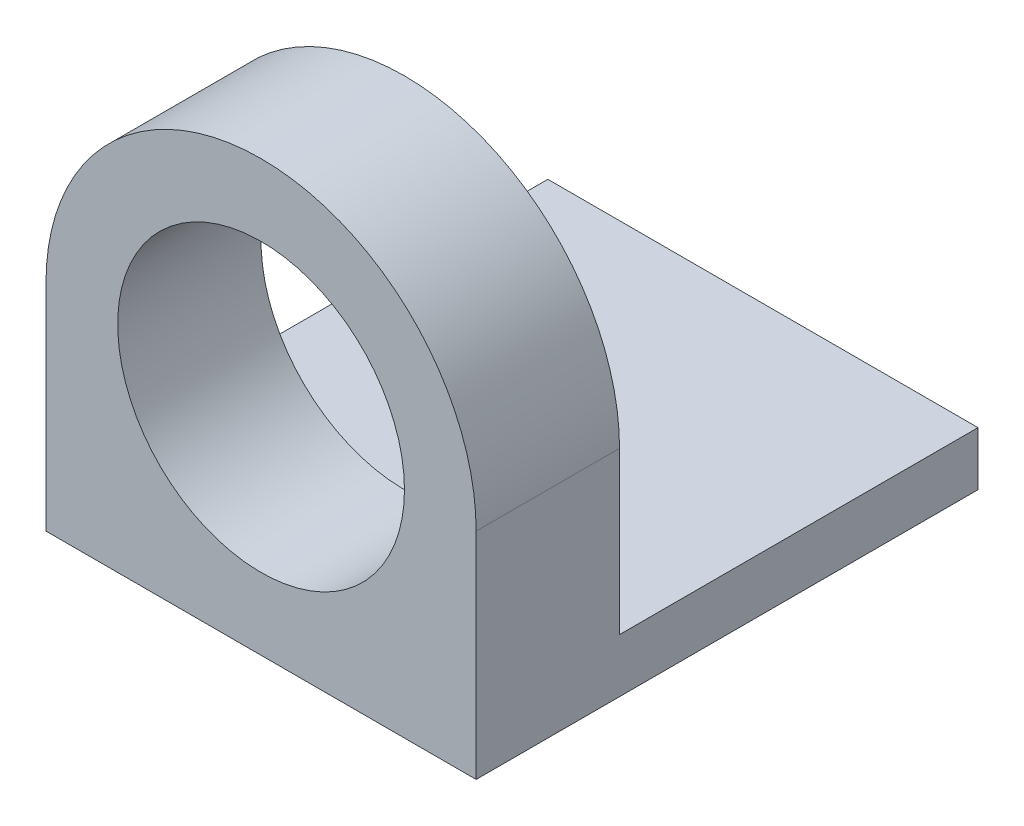
ISO-10303-21;
HEADER;
FILE_DESCRIPTION(('STEP AP214'),'2;1');
FILE_NAME('part.step','',(''),(''),'','','');
FILE_SCHEMA(('AUTOMOTIVE_DESIGN { 1 0 10303 214 1 1 1 1 }'));
ENDSEC;
DATA;
#1=APPLICATION_CONTEXT('core data for automotive mechanical design processes');
#2=APPLICATION_PROTOCOL_DEFINITION('international standard','automotive_design',2000,#1);
#3=PRODUCT_CONTEXT('',#1,'mechanical');
#4=PRODUCT('Part','Part','',(#3));
#5=PRODUCT_RELATED_PRODUCT_CATEGORY('part','',(#4));
#6=PRODUCT_DEFINITION_FORMATION('','',#4);
#7=PRODUCT_DEFINITION_CONTEXT('part definition',#1,'design');
#8=PRODUCT_DEFINITION('design','',#6,#7);
#9=PRODUCT_DEFINITION_SHAPE('','',#8);
#10=(LENGTH_UNIT() NAMED_UNIT(*) SI_UNIT(.MILLI.,.METRE.));
#11=(NAMED_UNIT(*) PLANE_ANGLE_UNIT() SI_UNIT($,.RADIAN.));
#12=(NAMED_UNIT(*) SI_UNIT($,.STERADIAN.) SOLID_ANGLE_UNIT());
#13=UNCERTAINTY_MEASURE_WITH_UNIT(LENGTH_MEASURE(1.E-05),#10,'distance_accuracy_value','');
#14=(GEOMETRIC_REPRESENTATION_CONTEXT(3) GLOBAL_UNCERTAINTY_ASSIGNED_CONTEXT((#13)) GLOBAL_UNIT_ASSIGNED_CONTEXT((#10,
#11,#12)) REPRESENTATION_CONTEXT('',''));
#15=CARTESIAN_POINT('',(0.,0.,0.));
#16=DIRECTION('',(0.,0.,1.));
#17=DIRECTION('',(1.,0.,0.));
#18=AXIS2_PLACEMENT_3D('',#15,#16,#17);
#19=CARTESIAN_POINT('',(0.,0.,0.));
#20=DIRECTION('',(0.,0.,1.));
#21=DIRECTION('',(1.,0.,0.));
#22=AXIS2_PLACEMENT_3D('',#19,#20,#21);
#23=PLANE('',#22);
#24=CARTESIAN_POINT('',(0.,0.,0.));
#25=DIRECTION('',(0.,0.,1.));
#26=DIRECTION('',(1.,0.,0.));
#27=AXIS2_PLACEMENT_3D('',#24,#25,#26);
#28=CIRCLE('',#27,4.);
#29=CARTESIAN_POINT('',(4.,0.,0.));
#30=VERTEX_POINT('',#29);
#31=EDGE_CURVE('E121',#30,#30,#28,.T.);
#32=ORIENTED_EDGE('',*,*,#31,.T.);
#33=EDGE_LOOP('',(#32));
#34=FACE_BOUND('',#33,.T.);
#35=DIRECTION('',(1.,0.,0.));
#36=VECTOR('',#35,1.);
#37=CARTESIAN_POINT('',(6.,-4.5,0.));
#38=LINE('',#37,#36);
#39=CARTESIAN_POINT('',(-6.,-4.5,0.));
#40=VERTEX_POINT('',#39);
#41=CARTESIAN_POINT('',(6.,-4.5,0.));
#42=VERTEX_POINT('',#41);
#43=EDGE_CURVE('E48',#40,#42,#38,.T.);
#44=ORIENTED_EDGE('',*,*,#43,.F.);
#45=DIRECTION('',(0.,-1.,0.));
#46=VECTOR('',#45,1.);
#47=CARTESIAN_POINT('',(-6.,0.,0.));
#48=LINE('',#47,#46);
#49=CARTESIAN_POINT('',(-6.,0.,0.));
#50=VERTEX_POINT('',#49);
#51=EDGE_CURVE('E129',#50,#40,#48,.T.);
#52=ORIENTED_EDGE('',*,*,#51,.F.);
#53=CARTESIAN_POINT('',(0.,0.,0.));
#54=DIRECTION('',(0.,0.,1.));
#55=DIRECTION('',(1.,0.,0.));
#56=AXIS2_PLACEMENT_3D('',#53,#54,#55);
#57=CIRCLE('',#56,6.);
#58=CARTESIAN_POINT('',(6.,0.,0.));
#59=VERTEX_POINT('',#58);
#60=EDGE_CURVE('E74',#59,#50,#57,.T.);
#61=ORIENTED_EDGE('',*,*,#60,.F.);
#62=DIRECTION('',(0.,1.,0.));
#63=VECTOR('',#62,1.);
#64=CARTESIAN_POINT('',(6.,0.,0.));
#65=LINE('',#64,#63);
#66=EDGE_CURVE('E125',#42,#59,#65,.T.);
#67=ORIENTED_EDGE('',*,*,#66,.F.);
#68=EDGE_LOOP('',(#44,#52,#61,#67));
#69=FACE_BOUND('',#68,.T.);
#70=ADVANCED_FACE('F33',(#34,#69),#23,.F.);
#71=CARTESIAN_POINT('',(0.,0.,4.));
#72=DIRECTION('',(0.,0.,1.));
#73=DIRECTION('',(1.,0.,0.));
#74=AXIS2_PLACEMENT_3D('',#71,#72,#73);
#75=PLANE('',#74);
#76=DIRECTION('',(1.,0.,0.));
#77=VECTOR('',#76,1.);
#78=CARTESIAN_POINT('',(0.,-6.,4.));
#79=LINE('',#78,#77);
#80=CARTESIAN_POINT('',(-6.,-6.,4.));
#81=VERTEX_POINT('',#80);
#82=CARTESIAN_POINT('',(6.,-6.,4.));
#83=VERTEX_POINT('',#82);
#84=EDGE_CURVE('E57',#81,#83,#79,.T.);
#85=ORIENTED_EDGE('',*,*,#84,.T.);
#86=DIRECTION('',(0.,1.,0.));
#87=VECTOR('',#86,1.);
#88=CARTESIAN_POINT('',(6.,0.,4.));
#89=LINE('',#88,#87);
#90=CARTESIAN_POINT('',(6.,0.,4.));
#91=VERTEX_POINT('',#90);
#92=EDGE_CURVE('E81',#83,#91,#89,.T.);
#93=ORIENTED_EDGE('',*,*,#92,.T.);
#94=CARTESIAN_POINT('',(0.,0.,4.));
#95=DIRECTION('',(0.,0.,1.));
#96=DIRECTION('',(1.,0.,0.));
#97=AXIS2_PLACEMENT_3D('',#94,#95,#96);
#98=CIRCLE('',#97,6.);
#99=CARTESIAN_POINT('',(-6.,0.,4.));
#100=VERTEX_POINT('',#99);
#101=EDGE_CURVE('E131',#91,#100,#98,.T.);
#102=ORIENTED_EDGE('',*,*,#101,.T.);
#103=DIRECTION('',(0.,-1.,0.));
#104=VECTOR('',#103,1.);
#105=CARTESIAN_POINT('',(-6.,0.,4.));
#106=LINE('',#105,#104);
#107=EDGE_CURVE('E133',#100,#81,#106,.T.);
#108=ORIENTED_EDGE('',*,*,#107,.T.);
#109=EDGE_LOOP('',(#85,#93,#102,#108));
#110=FACE_BOUND('',#109,.T.);
#111=CARTESIAN_POINT('',(0.,0.,4.));
#112=DIRECTION('',(0.,0.,1.));
#113=DIRECTION('',(1.,0.,0.));
#114=AXIS2_PLACEMENT_3D('',#111,#112,#113);
#115=CIRCLE('',#114,4.);
#116=CARTESIAN_POINT('',(4.,0.,4.));
#117=VERTEX_POINT('',#116);
#118=EDGE_CURVE('E122',#117,#117,#115,.T.);
#119=ORIENTED_EDGE('',*,*,#118,.F.);
#120=EDGE_LOOP('',(#119));
#121=FACE_BOUND('',#120,.T.);
#122=ADVANCED_FACE('F159',(#110,#121),#75,.T.);
#123=CARTESIAN_POINT('',(6.,0.,4.));
#124=DIRECTION('',(-1.,0.,0.));
#125=DIRECTION('',(0.,0.,1.));
#126=AXIS2_PLACEMENT_3D('',#123,#124,#125);
#127=PLANE('',#126);
#128=DIRECTION('',(0.,0.,-1.));
#129=VECTOR('',#128,1.);
#130=CARTESIAN_POINT('',(6.,-6.,4.));
#131=LINE('',#130,#129);
#132=CARTESIAN_POINT('',(6.,-6.,-10.));
#133=VERTEX_POINT('',#132);
#134=EDGE_CURVE('E11',#83,#133,#131,.T.);
#135=ORIENTED_EDGE('',*,*,#134,.T.);
#136=DIRECTION('',(0.,-1.,0.));
#137=VECTOR('',#136,1.);
#138=CARTESIAN_POINT('',(6.,-6.,-10.));
#139=LINE('',#138,#137);
#140=CARTESIAN_POINT('',(6.,-4.5,-10.));
#141=VERTEX_POINT('',#140);
#142=EDGE_CURVE('E97',#141,#133,#139,.T.);
#143=ORIENTED_EDGE('',*,*,#142,.F.);
#144=DIRECTION('',(0.,0.,1.));
#145=VECTOR('',#144,1.);
#146=CARTESIAN_POINT('',(6.,-4.5,-10.));
#147=LINE('',#146,#145);
#148=EDGE_CURVE('E115',#141,#42,#147,.T.);
#149=ORIENTED_EDGE('',*,*,#148,.T.);
#150=ORIENTED_EDGE('',*,*,#66,.T.);
#151=DIRECTION('',(0.,0.,-1.));
#152=VECTOR('',#151,1.);
#153=CARTESIAN_POINT('',(6.,0.,4.));
#154=LINE('',#153,#152);
#155=EDGE_CURVE('E41',#91,#59,#154,.T.);
#156=ORIENTED_EDGE('',*,*,#155,.F.);
#157=ORIENTED_EDGE('',*,*,#92,.F.);
#158=EDGE_LOOP('',(#135,#143,#149,#150,#156,#157));
#159=FACE_BOUND('',#158,.T.);
#160=ADVANCED_FACE('F35',(#159),#127,.F.);
#161=CARTESIAN_POINT('',(0.,0.,4.));
#162=DIRECTION('',(0.,0.,-1.));
#163=DIRECTION('',(-1.,0.,0.));
#164=AXIS2_PLACEMENT_3D('',#161,#162,#163);
#165=CYLINDRICAL_SURFACE('',#164,6.);
#166=ORIENTED_EDGE('',*,*,#60,.T.);
#167=DIRECTION('',(0.,0.,-1.));
#168=VECTOR('',#167,1.);
#169=CARTESIAN_POINT('',(-6.,0.,4.));
#170=LINE('',#169,#168);
#171=EDGE_CURVE('E139',#100,#50,#170,.T.);
#172=ORIENTED_EDGE('',*,*,#171,.F.);
#173=ORIENTED_EDGE('',*,*,#101,.F.);
#174=ORIENTED_EDGE('',*,*,#155,.T.);
#175=EDGE_LOOP('',(#166,#172,#173,#174));
#176=FACE_BOUND('',#175,.T.);
#177=ADVANCED_FACE('F141',(#176),#165,.T.);
#178=CARTESIAN_POINT('',(-6.,0.,4.));
#179=DIRECTION('',(1.,0.,0.));
#180=DIRECTION('',(0.,0.,-1.));
#181=AXIS2_PLACEMENT_3D('',#178,#179,#180);
#182=PLANE('',#181);
#183=ORIENTED_EDGE('',*,*,#51,.T.);
#184=DIRECTION('',(0.,0.,1.));
#185=VECTOR('',#184,1.);
#186=CARTESIAN_POINT('',(-6.,-4.5,-10.));
#187=LINE('',#186,#185);
#188=CARTESIAN_POINT('',(-6.,-4.5,-10.));
#189=VERTEX_POINT('',#188);
#190=EDGE_CURVE('E118',#189,#40,#187,.T.);
#191=ORIENTED_EDGE('',*,*,#190,.F.);
#192=DIRECTION('',(0.,1.,0.));
#193=VECTOR('',#192,1.);
#194=CARTESIAN_POINT('',(-6.,-6.,-10.));
#195=LINE('',#194,#193);
#196=CARTESIAN_POINT('',(-6.,-6.,-10.));
#197=VERTEX_POINT('',#196);
#198=EDGE_CURVE('E105',#197,#189,#195,.T.);
#199=ORIENTED_EDGE('',*,*,#198,.F.);
#200=DIRECTION('',(0.,0.,-1.));
#201=VECTOR('',#200,1.);
#202=CARTESIAN_POINT('',(-6.,-6.,4.));
#203=LINE('',#202,#201);
#204=EDGE_CURVE('E102',#81,#197,#203,.T.);
#205=ORIENTED_EDGE('',*,*,#204,.F.);
#206=ORIENTED_EDGE('',*,*,#107,.F.);
#207=ORIENTED_EDGE('',*,*,#171,.T.);
#208=EDGE_LOOP('',(#183,#191,#199,#205,#206,#207));
#209=FACE_BOUND('',#208,.T.);
#210=ADVANCED_FACE('F144',(#209),#182,.F.);
#211=CARTESIAN_POINT('',(0.,-6.,4.));
#212=DIRECTION('',(0.,1.,0.));
#213=DIRECTION('',(0.,0.,1.));
#214=AXIS2_PLACEMENT_3D('',#211,#212,#213);
#215=PLANE('',#214);
#216=ORIENTED_EDGE('',*,*,#204,.T.);
#217=DIRECTION('',(-1.,0.,0.));
#218=VECTOR('',#217,1.);
#219=CARTESIAN_POINT('',(6.,-6.,-10.));
#220=LINE('',#219,#218);
#221=EDGE_CURVE('E99',#133,#197,#220,.T.);
#222=ORIENTED_EDGE('',*,*,#221,.F.);
#223=ORIENTED_EDGE('',*,*,#134,.F.);
#224=ORIENTED_EDGE('',*,*,#84,.F.);
#225=EDGE_LOOP('',(#216,#222,#223,#224));
#226=FACE_BOUND('',#225,.T.);
#227=ADVANCED_FACE('F100',(#226),#215,.F.);
#228=CARTESIAN_POINT('',(0.,0.,4.));
#229=DIRECTION('',(0.,0.,-1.));
#230=DIRECTION('',(-1.,0.,0.));
#231=AXIS2_PLACEMENT_3D('',#228,#229,#230);
#232=CYLINDRICAL_SURFACE('',#231,4.);
#233=ORIENTED_EDGE('',*,*,#118,.T.);
#234=EDGE_LOOP('',(#233));
#235=FACE_BOUND('',#234,.T.);
#236=ORIENTED_EDGE('',*,*,#31,.F.);
#237=EDGE_LOOP('',(#236));
#238=FACE_BOUND('',#237,.T.);
#239=ADVANCED_FACE('F149',(#235,#238),#232,.F.);
#240=CARTESIAN_POINT('',(6.,-4.5,-10.));
#241=DIRECTION('',(0.,-1.,0.));
#242=DIRECTION('',(0.,0.,-1.));
#243=AXIS2_PLACEMENT_3D('',#240,#241,#242);
#244=PLANE('',#243);
#245=ORIENTED_EDGE('',*,*,#43,.T.);
#246=ORIENTED_EDGE('',*,*,#148,.F.);
#247=DIRECTION('',(1.,0.,0.));
#248=VECTOR('',#247,1.);
#249=CARTESIAN_POINT('',(6.,-4.5,-10.));
#250=LINE('',#249,#248);
#251=EDGE_CURVE('E109',#189,#141,#250,.T.);
#252=ORIENTED_EDGE('',*,*,#251,.F.);
#253=ORIENTED_EDGE('',*,*,#190,.T.);
#254=EDGE_LOOP('',(#245,#246,#252,#253));
#255=FACE_BOUND('',#254,.T.);
#256=ADVANCED_FACE('F147',(#255),#244,.F.);
#257=CARTESIAN_POINT('',(0.,0.,-10.));
#258=DIRECTION('',(0.,0.,1.));
#259=DIRECTION('',(1.,0.,0.));
#260=AXIS2_PLACEMENT_3D('',#257,#258,#259);
#261=PLANE('',#260);
#262=ORIENTED_EDGE('',*,*,#142,.T.);
#263=ORIENTED_EDGE('',*,*,#221,.T.);
#264=ORIENTED_EDGE('',*,*,#198,.T.);
#265=ORIENTED_EDGE('',*,*,#251,.T.);
#266=EDGE_LOOP('',(#262,#263,#264,#265));
#267=FACE_BOUND('',#266,.T.);
#268=ADVANCED_FACE('F107',(#267),#261,.F.);
#269=CLOSED_SHELL('',(#70,#122,#160,#177,#210,#227,#239,#256,#268));
#270=MANIFOLD_SOLID_BREP('B2',#269);
#271=ADVANCED_BREP_SHAPE_REPRESENTATION('',(#18,#270),#14);
#272=SHAPE_DEFINITION_REPRESENTATION(#9,#271);
ENDSEC;
END-ISO-10303-21;
